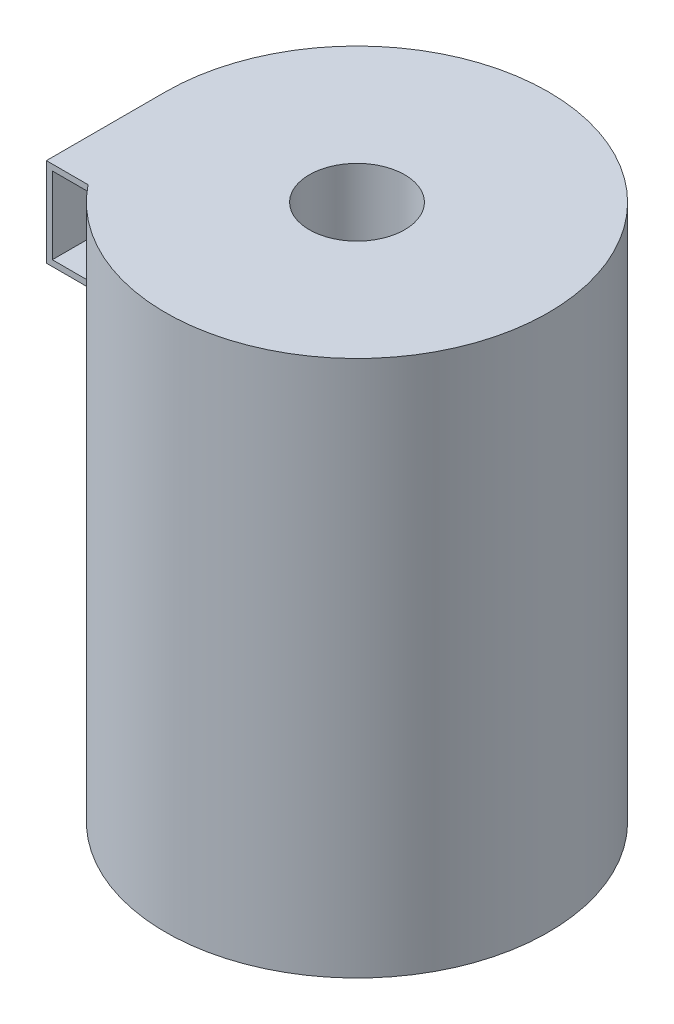
ISO-10303-21;
HEADER;
FILE_DESCRIPTION(('STEP AP214'),'2;1');
FILE_NAME('part.step','',(''),(''),'','','');
FILE_SCHEMA(('AUTOMOTIVE_DESIGN { 1 0 10303 214 1 1 1 1 }'));
ENDSEC;
DATA;
#1=APPLICATION_CONTEXT('core data for automotive mechanical design processes');
#2=APPLICATION_PROTOCOL_DEFINITION('international standard','automotive_design',2000,#1);
#3=PRODUCT_CONTEXT('',#1,'mechanical');
#4=PRODUCT('Part','Part','',(#3));
#5=PRODUCT_RELATED_PRODUCT_CATEGORY('part','',(#4));
#6=PRODUCT_DEFINITION_FORMATION('','',#4);
#7=PRODUCT_DEFINITION_CONTEXT('part definition',#1,'design');
#8=PRODUCT_DEFINITION('design','',#6,#7);
#9=PRODUCT_DEFINITION_SHAPE('','',#8);
#10=(LENGTH_UNIT() NAMED_UNIT(*) SI_UNIT(.MILLI.,.METRE.));
#11=(NAMED_UNIT(*) PLANE_ANGLE_UNIT() SI_UNIT($,.RADIAN.));
#12=(NAMED_UNIT(*) SI_UNIT($,.STERADIAN.) SOLID_ANGLE_UNIT());
#13=UNCERTAINTY_MEASURE_WITH_UNIT(LENGTH_MEASURE(1.E-05),#10,'distance_accuracy_value','');
#14=(GEOMETRIC_REPRESENTATION_CONTEXT(3) GLOBAL_UNCERTAINTY_ASSIGNED_CONTEXT((#13)) GLOBAL_UNIT_ASSIGNED_CONTEXT((#10,
#11,#12)) REPRESENTATION_CONTEXT('',''));
#15=CARTESIAN_POINT('',(0.,0.,0.));
#16=DIRECTION('',(0.,0.,1.));
#17=DIRECTION('',(1.,0.,0.));
#18=AXIS2_PLACEMENT_3D('',#15,#16,#17);
#19=CARTESIAN_POINT('',(0.,0.,0.));
#20=DIRECTION('',(0.,-1.,0.));
#21=DIRECTION('',(0.,0.,-1.));
#22=AXIS2_PLACEMENT_3D('',#19,#20,#21);
#23=CYLINDRICAL_SURFACE('',#22,8.);
#24=CARTESIAN_POINT('',(0.,19.,0.));
#25=DIRECTION('',(0.,-1.,0.));
#26=DIRECTION('',(0.,0.,-1.));
#27=AXIS2_PLACEMENT_3D('',#24,#25,#26);
#28=CIRCLE('',#27,8.);
#29=CARTESIAN_POINT('',(0.,19.,-8.));
#30=VERTEX_POINT('',#29);
#31=EDGE_CURVE('E154',#30,#30,#28,.T.);
#32=ORIENTED_EDGE('',*,*,#31,.T.);
#33=EDGE_LOOP('',(#32));
#34=FACE_BOUND('',#33,.T.);
#35=CARTESIAN_POINT('',(0.,90.,0.));
#36=DIRECTION('',(0.,-1.,0.));
#37=DIRECTION('',(0.,0.,-1.));
#38=AXIS2_PLACEMENT_3D('',#35,#36,#37);
#39=CIRCLE('',#38,8.);
#40=CARTESIAN_POINT('',(0.,90.,-8.));
#41=VERTEX_POINT('',#40);
#42=EDGE_CURVE('E183',#41,#41,#39,.T.);
#43=ORIENTED_EDGE('',*,*,#42,.F.);
#44=EDGE_LOOP('',(#43));
#45=FACE_BOUND('',#44,.T.);
#46=ADVANCED_FACE('F39',(#34,#45),#23,.F.);
#47=CARTESIAN_POINT('',(8.,90.,0.));
#48=DIRECTION('',(0.,1.,0.));
#49=DIRECTION('',(0.,0.,1.));
#50=AXIS2_PLACEMENT_3D('',#47,#48,#49);
#51=PLANE('',#50);
#52=DIRECTION('',(-1.,0.,0.));
#53=VECTOR('',#52,1.);
#54=CARTESIAN_POINT('',(-32.1,90.,20.));
#55=LINE('',#54,#53);
#56=CARTESIAN_POINT('',(-25.1079668631293,90.,20.));
#57=VERTEX_POINT('',#56);
#58=CARTESIAN_POINT('',(-32.1,90.,20.));
#59=VERTEX_POINT('',#58);
#60=EDGE_CURVE('E165',#57,#59,#55,.T.);
#61=ORIENTED_EDGE('',*,*,#60,.F.);
#62=CARTESIAN_POINT('',(0.,90.,0.));
#63=DIRECTION('',(0.,-1.,0.));
#64=DIRECTION('',(0.,0.,-1.));
#65=AXIS2_PLACEMENT_3D('',#62,#63,#64);
#66=CIRCLE('',#65,32.1);
#67=CARTESIAN_POINT('',(-32.1,90.,0.));
#68=VERTEX_POINT('',#67);
#69=EDGE_CURVE('E179',#68,#57,#66,.T.);
#70=ORIENTED_EDGE('',*,*,#69,.F.);
#71=DIRECTION('',(0.,0.,-1.));
#72=VECTOR('',#71,1.);
#73=CARTESIAN_POINT('',(-32.1,90.,20.));
#74=LINE('',#73,#72);
#75=EDGE_CURVE('E63',#59,#68,#74,.T.);
#76=ORIENTED_EDGE('',*,*,#75,.F.);
#77=EDGE_LOOP('',(#61,#70,#76));
#78=FACE_BOUND('',#77,.T.);
#79=ORIENTED_EDGE('',*,*,#42,.T.);
#80=EDGE_LOOP('',(#79));
#81=FACE_BOUND('',#80,.T.);
#82=ADVANCED_FACE('F223',(#78,#81),#51,.T.);
#83=CARTESIAN_POINT('',(0.,0.,0.));
#84=DIRECTION('',(0.,-1.,0.));
#85=DIRECTION('',(0.,0.,-1.));
#86=AXIS2_PLACEMENT_3D('',#83,#84,#85);
#87=CYLINDRICAL_SURFACE('',#86,32.1);
#88=DIRECTION('',(0.,-1.,0.));
#89=VECTOR('',#88,1.);
#90=CARTESIAN_POINT('',(-25.1079668631293,0.,20.));
#91=LINE('',#90,#89);
#92=CARTESIAN_POINT('',(-25.1079668631293,75.1,20.));
#93=VERTEX_POINT('',#92);
#94=CARTESIAN_POINT('',(-25.1079668631293,76.1,20.));
#95=VERTEX_POINT('',#94);
#96=EDGE_CURVE('E42',#93,#95,#91,.F.);
#97=ORIENTED_EDGE('',*,*,#96,.F.);
#98=CARTESIAN_POINT('',(0.,75.1,0.));
#99=DIRECTION('',(0.,1.,0.));
#100=DIRECTION('',(0.,0.,1.));
#101=AXIS2_PLACEMENT_3D('',#98,#99,#100);
#102=CIRCLE('',#101,32.1);
#103=CARTESIAN_POINT('',(-32.1,75.1,0.));
#104=VERTEX_POINT('',#103);
#105=EDGE_CURVE('E187',#93,#104,#102,.F.);
#106=ORIENTED_EDGE('',*,*,#105,.T.);
#107=DIRECTION('',(0.,-1.,0.));
#108=VECTOR('',#107,1.);
#109=CARTESIAN_POINT('',(-32.1,90.,0.));
#110=LINE('',#109,#108);
#111=EDGE_CURVE('E161',#68,#104,#110,.T.);
#112=ORIENTED_EDGE('',*,*,#111,.F.);
#113=ORIENTED_EDGE('',*,*,#69,.T.);
#114=CARTESIAN_POINT('',(-25.1079668631293,89.,20.));
#115=VERTEX_POINT('',#114);
#116=EDGE_CURVE('E192',#115,#57,#91,.F.);
#117=ORIENTED_EDGE('',*,*,#116,.F.);
#118=EDGE_CURVE('E196',#95,#115,#91,.F.);
#119=ORIENTED_EDGE('',*,*,#118,.F.);
#120=EDGE_LOOP('',(#97,#106,#112,#113,#117,#119));
#121=FACE_BOUND('',#120,.T.);
#122=CARTESIAN_POINT('',(0.,0.,0.));
#123=DIRECTION('',(0.,-1.,0.));
#124=DIRECTION('',(0.,0.,-1.));
#125=AXIS2_PLACEMENT_3D('',#122,#123,#124);
#126=CIRCLE('',#125,32.1);
#127=CARTESIAN_POINT('',(0.,0.,-32.1));
#128=VERTEX_POINT('',#127);
#129=EDGE_CURVE('E175',#128,#128,#126,.T.);
#130=ORIENTED_EDGE('',*,*,#129,.F.);
#131=EDGE_LOOP('',(#130));
#132=FACE_BOUND('',#131,.T.);
#133=ADVANCED_FACE('F206',(#121,#132),#87,.T.);
#134=CARTESIAN_POINT('',(32.1,0.,0.));
#135=DIRECTION('',(0.,-1.,0.));
#136=DIRECTION('',(0.,0.,-1.));
#137=AXIS2_PLACEMENT_3D('',#134,#135,#136);
#138=PLANE('',#137);
#139=CARTESIAN_POINT('',(0.,0.,0.));
#140=DIRECTION('',(0.,-1.,0.));
#141=DIRECTION('',(0.,0.,-1.));
#142=AXIS2_PLACEMENT_3D('',#139,#140,#141);
#143=CIRCLE('',#142,31.1);
#144=CARTESIAN_POINT('',(0.,0.,-31.1));
#145=VERTEX_POINT('',#144);
#146=EDGE_CURVE('E127',#145,#145,#143,.T.);
#147=ORIENTED_EDGE('',*,*,#146,.F.);
#148=EDGE_LOOP('',(#147));
#149=FACE_BOUND('',#148,.T.);
#150=ORIENTED_EDGE('',*,*,#129,.T.);
#151=EDGE_LOOP('',(#150));
#152=FACE_BOUND('',#151,.T.);
#153=ADVANCED_FACE('F300',(#149,#152),#138,.T.);
#154=CARTESIAN_POINT('',(-32.1,90.,20.));
#155=DIRECTION('',(1.,0.,0.));
#156=DIRECTION('',(0.,0.,-1.));
#157=AXIS2_PLACEMENT_3D('',#154,#155,#156);
#158=PLANE('',#157);
#159=ORIENTED_EDGE('',*,*,#111,.T.);
#160=DIRECTION('',(0.,0.,-1.));
#161=VECTOR('',#160,1.);
#162=CARTESIAN_POINT('',(-32.1,75.1,20.));
#163=LINE('',#162,#161);
#164=CARTESIAN_POINT('',(-32.1,75.1,20.));
#165=VERTEX_POINT('',#164);
#166=EDGE_CURVE('E172',#165,#104,#163,.T.);
#167=ORIENTED_EDGE('',*,*,#166,.F.);
#168=DIRECTION('',(0.,-1.,0.));
#169=VECTOR('',#168,1.);
#170=CARTESIAN_POINT('',(-32.1,90.,20.));
#171=LINE('',#170,#169);
#172=EDGE_CURVE('E156',#59,#165,#171,.T.);
#173=ORIENTED_EDGE('',*,*,#172,.F.);
#174=ORIENTED_EDGE('',*,*,#75,.T.);
#175=EDGE_LOOP('',(#159,#167,#173,#174));
#176=FACE_BOUND('',#175,.T.);
#177=ADVANCED_FACE('F305',(#176),#158,.F.);
#178=CARTESIAN_POINT('',(-32.1,75.1,20.));
#179=DIRECTION('',(0.,1.,0.));
#180=DIRECTION('',(0.,0.,1.));
#181=AXIS2_PLACEMENT_3D('',#178,#179,#180);
#182=PLANE('',#181);
#183=ORIENTED_EDGE('',*,*,#105,.F.);
#184=DIRECTION('',(1.,0.,0.));
#185=VECTOR('',#184,1.);
#186=CARTESIAN_POINT('',(-32.1,75.1,20.));
#187=LINE('',#186,#185);
#188=EDGE_CURVE('E160',#165,#93,#187,.T.);
#189=ORIENTED_EDGE('',*,*,#188,.F.);
#190=ORIENTED_EDGE('',*,*,#166,.T.);
#191=EDGE_LOOP('',(#183,#189,#190));
#192=FACE_BOUND('',#191,.T.);
#193=ADVANCED_FACE('F245',(#192),#182,.F.);
#194=CARTESIAN_POINT('',(0.,0.,20.));
#195=DIRECTION('',(0.,0.,1.));
#196=DIRECTION('',(1.,0.,0.));
#197=AXIS2_PLACEMENT_3D('',#194,#195,#196);
#198=PLANE('',#197);
#199=DIRECTION('',(1.,0.,0.));
#200=VECTOR('',#199,1.);
#201=CARTESIAN_POINT('',(-32.1,76.1,20.));
#202=LINE('',#201,#200);
#203=CARTESIAN_POINT('',(-31.1,76.1,20.));
#204=VERTEX_POINT('',#203);
#205=EDGE_CURVE('E146',#204,#95,#202,.T.);
#206=ORIENTED_EDGE('',*,*,#205,.F.);
#207=DIRECTION('',(0.,-1.,0.));
#208=VECTOR('',#207,1.);
#209=CARTESIAN_POINT('',(-31.1,90.,20.));
#210=LINE('',#209,#208);
#211=CARTESIAN_POINT('',(-31.1,89.,20.));
#212=VERTEX_POINT('',#211);
#213=EDGE_CURVE('E118',#212,#204,#210,.T.);
#214=ORIENTED_EDGE('',*,*,#213,.F.);
#215=DIRECTION('',(-1.,0.,0.));
#216=VECTOR('',#215,1.);
#217=CARTESIAN_POINT('',(0.,89.,20.));
#218=LINE('',#217,#216);
#219=EDGE_CURVE('E11',#115,#212,#218,.T.);
#220=ORIENTED_EDGE('',*,*,#219,.F.);
#221=ORIENTED_EDGE('',*,*,#116,.T.);
#222=ORIENTED_EDGE('',*,*,#60,.T.);
#223=ORIENTED_EDGE('',*,*,#172,.T.);
#224=ORIENTED_EDGE('',*,*,#188,.T.);
#225=ORIENTED_EDGE('',*,*,#96,.T.);
#226=EDGE_LOOP('',(#206,#214,#220,#221,#222,#223,#224,#225));
#227=FACE_BOUND('',#226,.T.);
#228=ADVANCED_FACE('F204',(#227),#198,.T.);
#229=CARTESIAN_POINT('',(0.,19.,0.));
#230=DIRECTION('',(0.,1.,0.));
#231=DIRECTION('',(0.,0.,1.));
#232=AXIS2_PLACEMENT_3D('',#229,#230,#231);
#233=PLANE('',#232);
#234=CARTESIAN_POINT('',(0.,19.,0.));
#235=DIRECTION('',(0.,1.,0.));
#236=DIRECTION('',(0.,0.,1.));
#237=AXIS2_PLACEMENT_3D('',#234,#235,#236);
#238=CIRCLE('',#237,9.);
#239=CARTESIAN_POINT('',(0.,19.,9.));
#240=VERTEX_POINT('',#239);
#241=EDGE_CURVE('E132',#240,#240,#238,.F.);
#242=ORIENTED_EDGE('',*,*,#241,.T.);
#243=EDGE_LOOP('',(#242));
#244=FACE_BOUND('',#243,.T.);
#245=ORIENTED_EDGE('',*,*,#31,.F.);
#246=EDGE_LOOP('',(#245));
#247=FACE_BOUND('',#246,.T.);
#248=ADVANCED_FACE('F234',(#244,#247),#233,.F.);
#249=CARTESIAN_POINT('',(0.,0.,0.));
#250=DIRECTION('',(0.,-1.,0.));
#251=DIRECTION('',(0.,0.,-1.));
#252=AXIS2_PLACEMENT_3D('',#249,#250,#251);
#253=CYLINDRICAL_SURFACE('',#252,9.);
#254=ORIENTED_EDGE('',*,*,#241,.F.);
#255=EDGE_LOOP('',(#254));
#256=FACE_BOUND('',#255,.T.);
#257=CARTESIAN_POINT('',(0.,89.,0.));
#258=DIRECTION('',(0.,1.,0.));
#259=DIRECTION('',(0.,0.,1.));
#260=AXIS2_PLACEMENT_3D('',#257,#258,#259);
#261=CIRCLE('',#260,9.);
#262=CARTESIAN_POINT('',(0.,89.,9.));
#263=VERTEX_POINT('',#262);
#264=EDGE_CURVE('E126',#263,#263,#261,.F.);
#265=ORIENTED_EDGE('',*,*,#264,.T.);
#266=EDGE_LOOP('',(#265));
#267=FACE_BOUND('',#266,.T.);
#268=ADVANCED_FACE('F236',(#256,#267),#253,.T.);
#269=CARTESIAN_POINT('',(8.,89.,0.));
#270=DIRECTION('',(0.,1.,0.));
#271=DIRECTION('',(0.,0.,1.));
#272=AXIS2_PLACEMENT_3D('',#269,#270,#271);
#273=PLANE('',#272);
#274=CARTESIAN_POINT('',(-23.8161709768804,89.,20.));
#275=VERTEX_POINT('',#274);
#276=EDGE_CURVE('E49',#275,#115,#218,.T.);
#277=ORIENTED_EDGE('',*,*,#276,.T.);
#278=ORIENTED_EDGE('',*,*,#219,.T.);
#279=DIRECTION('',(0.,0.,-1.));
#280=VECTOR('',#279,1.);
#281=CARTESIAN_POINT('',(-31.1,89.,0.));
#282=LINE('',#281,#280);
#283=CARTESIAN_POINT('',(-31.1,89.,0.));
#284=VERTEX_POINT('',#283);
#285=EDGE_CURVE('E56',#212,#284,#282,.T.);
#286=ORIENTED_EDGE('',*,*,#285,.T.);
#287=CARTESIAN_POINT('',(0.,89.,0.));
#288=DIRECTION('',(0.,1.,0.));
#289=DIRECTION('',(0.,0.,1.));
#290=AXIS2_PLACEMENT_3D('',#287,#288,#289);
#291=CIRCLE('',#290,31.1);
#292=EDGE_CURVE('E104',#284,#275,#291,.F.);
#293=ORIENTED_EDGE('',*,*,#292,.T.);
#294=EDGE_LOOP('',(#277,#278,#286,#293));
#295=FACE_BOUND('',#294,.T.);
#296=ORIENTED_EDGE('',*,*,#264,.F.);
#297=EDGE_LOOP('',(#296));
#298=FACE_BOUND('',#297,.T.);
#299=ADVANCED_FACE('F101',(#295,#298),#273,.F.);
#300=CARTESIAN_POINT('',(0.,0.,0.));
#301=DIRECTION('',(0.,-1.,0.));
#302=DIRECTION('',(0.,0.,-1.));
#303=AXIS2_PLACEMENT_3D('',#300,#301,#302);
#304=CYLINDRICAL_SURFACE('',#303,31.1);
#305=DIRECTION('',(0.,-1.,0.));
#306=VECTOR('',#305,1.);
#307=CARTESIAN_POINT('',(-23.8161709768804,76.1,20.));
#308=LINE('',#307,#306);
#309=CARTESIAN_POINT('',(-23.8161709768804,76.1,20.));
#310=VERTEX_POINT('',#309);
#311=EDGE_CURVE('E123',#310,#275,#308,.F.);
#312=ORIENTED_EDGE('',*,*,#311,.T.);
#313=ORIENTED_EDGE('',*,*,#292,.F.);
#314=DIRECTION('',(0.,1.,0.));
#315=VECTOR('',#314,1.);
#316=CARTESIAN_POINT('',(-31.1,90.,0.));
#317=LINE('',#316,#315);
#318=CARTESIAN_POINT('',(-31.1,76.1,0.));
#319=VERTEX_POINT('',#318);
#320=EDGE_CURVE('E111',#284,#319,#317,.F.);
#321=ORIENTED_EDGE('',*,*,#320,.T.);
#322=CARTESIAN_POINT('',(0.,76.1,0.));
#323=DIRECTION('',(0.,1.,0.));
#324=DIRECTION('',(0.,0.,1.));
#325=AXIS2_PLACEMENT_3D('',#322,#323,#324);
#326=CIRCLE('',#325,31.1);
#327=EDGE_CURVE('E137',#310,#319,#326,.F.);
#328=ORIENTED_EDGE('',*,*,#327,.F.);
#329=EDGE_LOOP('',(#312,#313,#321,#328));
#330=FACE_BOUND('',#329,.T.);
#331=ORIENTED_EDGE('',*,*,#146,.T.);
#332=EDGE_LOOP('',(#331));
#333=FACE_BOUND('',#332,.T.);
#334=ADVANCED_FACE('F120',(#330,#333),#304,.F.);
#335=CARTESIAN_POINT('',(-31.1,90.,20.));
#336=DIRECTION('',(1.,0.,0.));
#337=DIRECTION('',(0.,0.,-1.));
#338=AXIS2_PLACEMENT_3D('',#335,#336,#337);
#339=PLANE('',#338);
#340=ORIENTED_EDGE('',*,*,#320,.F.);
#341=ORIENTED_EDGE('',*,*,#285,.F.);
#342=ORIENTED_EDGE('',*,*,#213,.T.);
#343=DIRECTION('',(0.,0.,-1.));
#344=VECTOR('',#343,1.);
#345=CARTESIAN_POINT('',(-31.1,76.1,20.));
#346=LINE('',#345,#344);
#347=EDGE_CURVE('E108',#204,#319,#346,.T.);
#348=ORIENTED_EDGE('',*,*,#347,.T.);
#349=EDGE_LOOP('',(#340,#341,#342,#348));
#350=FACE_BOUND('',#349,.T.);
#351=ADVANCED_FACE('F112',(#350),#339,.T.);
#352=CARTESIAN_POINT('',(-32.1,76.1,20.));
#353=DIRECTION('',(0.,1.,0.));
#354=DIRECTION('',(0.,0.,1.));
#355=AXIS2_PLACEMENT_3D('',#352,#353,#354);
#356=PLANE('',#355);
#357=ORIENTED_EDGE('',*,*,#327,.T.);
#358=ORIENTED_EDGE('',*,*,#347,.F.);
#359=ORIENTED_EDGE('',*,*,#205,.T.);
#360=EDGE_CURVE('E149',#95,#310,#202,.T.);
#361=ORIENTED_EDGE('',*,*,#360,.T.);
#362=EDGE_LOOP('',(#357,#358,#359,#361));
#363=FACE_BOUND('',#362,.T.);
#364=ADVANCED_FACE('F211',(#363),#356,.T.);
#365=CARTESIAN_POINT('',(0.,0.,20.));
#366=DIRECTION('',(0.,0.,1.));
#367=DIRECTION('',(1.,0.,0.));
#368=AXIS2_PLACEMENT_3D('',#365,#366,#367);
#369=PLANE('',#368);
#370=ORIENTED_EDGE('',*,*,#118,.T.);
#371=ORIENTED_EDGE('',*,*,#276,.F.);
#372=ORIENTED_EDGE('',*,*,#311,.F.);
#373=ORIENTED_EDGE('',*,*,#360,.F.);
#374=EDGE_LOOP('',(#370,#371,#372,#373));
#375=FACE_BOUND('',#374,.T.);
#376=ADVANCED_FACE('F209',(#375),#369,.F.);
#377=CLOSED_SHELL('',(#46,#82,#133,#153,#177,#193,#228,#248,#268,#299,#334,#351,#364,#376));
#378=MANIFOLD_SOLID_BREP('B2',#377);
#379=ADVANCED_BREP_SHAPE_REPRESENTATION('',(#18,#378),#14);
#380=SHAPE_DEFINITION_REPRESENTATION(#9,#379);
ENDSEC;
END-ISO-10303-21;
